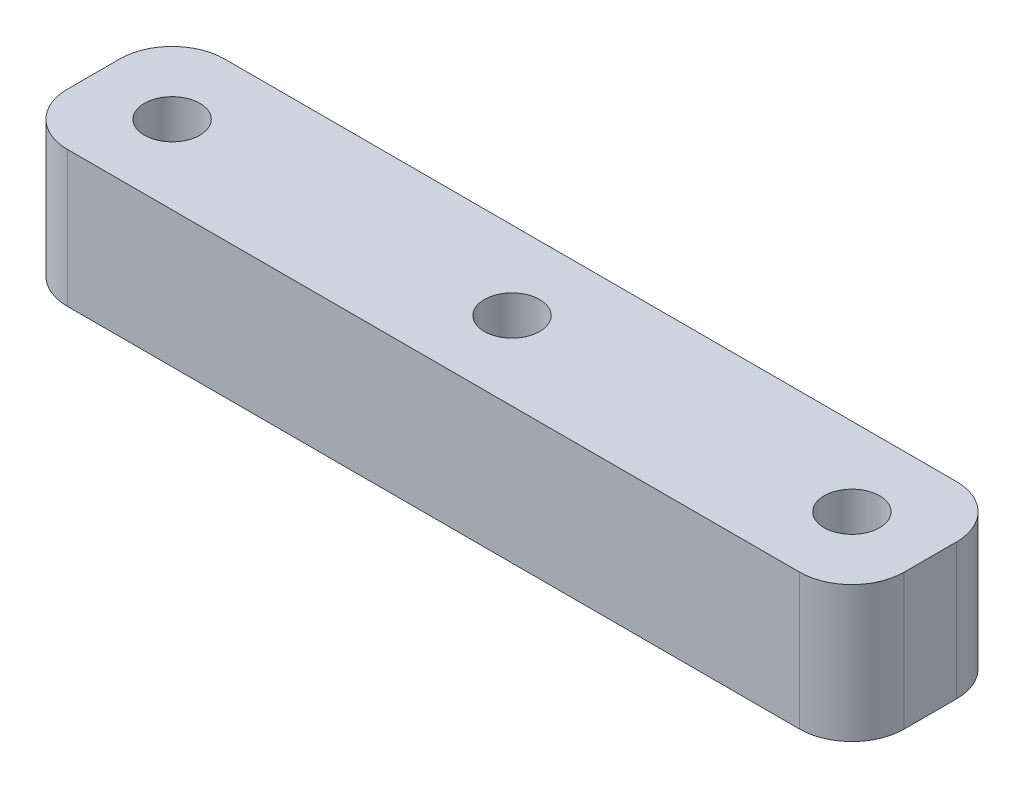
ISO-10303-21;
HEADER;
FILE_DESCRIPTION(('STEP AP214'),'2;1');
FILE_NAME('part.step','',(''),(''),'','','');
FILE_SCHEMA(('AUTOMOTIVE_DESIGN { 1 0 10303 214 1 1 1 1 }'));
ENDSEC;
DATA;
#1=APPLICATION_CONTEXT('core data for automotive mechanical design processes');
#2=APPLICATION_PROTOCOL_DEFINITION('international standard','automotive_design',2000,#1);
#3=PRODUCT_CONTEXT('',#1,'mechanical');
#4=PRODUCT('Part','Part','',(#3));
#5=PRODUCT_RELATED_PRODUCT_CATEGORY('part','',(#4));
#6=PRODUCT_DEFINITION_FORMATION('','',#4);
#7=PRODUCT_DEFINITION_CONTEXT('part definition',#1,'design');
#8=PRODUCT_DEFINITION('design','',#6,#7);
#9=PRODUCT_DEFINITION_SHAPE('','',#8);
#10=(LENGTH_UNIT() NAMED_UNIT(*) SI_UNIT(.MILLI.,.METRE.));
#11=(NAMED_UNIT(*) PLANE_ANGLE_UNIT() SI_UNIT($,.RADIAN.));
#12=(NAMED_UNIT(*) SI_UNIT($,.STERADIAN.) SOLID_ANGLE_UNIT());
#13=UNCERTAINTY_MEASURE_WITH_UNIT(LENGTH_MEASURE(1.E-05),#10,'distance_accuracy_value','');
#14=(GEOMETRIC_REPRESENTATION_CONTEXT(3) GLOBAL_UNCERTAINTY_ASSIGNED_CONTEXT((#13)) GLOBAL_UNIT_ASSIGNED_CONTEXT((#10,
#11,#12)) REPRESENTATION_CONTEXT('',''));
#15=CARTESIAN_POINT('',(0.,0.,0.));
#16=DIRECTION('',(0.,0.,1.));
#17=DIRECTION('',(1.,0.,0.));
#18=AXIS2_PLACEMENT_3D('',#15,#16,#17);
#19=CARTESIAN_POINT('',(-40.,-13.,-7.50000000000001));
#20=DIRECTION('',(-1.,0.,0.));
#21=DIRECTION('',(0.,0.,1.));
#22=AXIS2_PLACEMENT_3D('',#19,#20,#21);
#23=PLANE('',#22);
#24=DIRECTION('',(0.,0.,1.));
#25=VECTOR('',#24,1.);
#26=CARTESIAN_POINT('',(-40.,0.,-7.50000000000001));
#27=LINE('',#26,#25);
#28=CARTESIAN_POINT('',(-40.,0.,-2.50000000000001));
#29=VERTEX_POINT('',#28);
#30=CARTESIAN_POINT('',(-40.,0.,2.49999999999999));
#31=VERTEX_POINT('',#30);
#32=EDGE_CURVE('E185',#29,#31,#27,.T.);
#33=ORIENTED_EDGE('',*,*,#32,.F.);
#34=DIRECTION('',(0.,1.,0.));
#35=VECTOR('',#34,1.);
#36=CARTESIAN_POINT('',(-40.,-13.,-2.50000000000001));
#37=LINE('',#36,#35);
#38=CARTESIAN_POINT('',(-40.,-13.,-2.50000000000001));
#39=VERTEX_POINT('',#38);
#40=EDGE_CURVE('E155',#29,#39,#37,.F.);
#41=ORIENTED_EDGE('',*,*,#40,.T.);
#42=DIRECTION('',(0.,0.,1.));
#43=VECTOR('',#42,1.);
#44=CARTESIAN_POINT('',(-40.,-13.,-7.50000000000001));
#45=LINE('',#44,#43);
#46=CARTESIAN_POINT('',(-40.,-13.,2.49999999999999));
#47=VERTEX_POINT('',#46);
#48=EDGE_CURVE('E129',#39,#47,#45,.T.);
#49=ORIENTED_EDGE('',*,*,#48,.T.);
#50=DIRECTION('',(0.,1.,0.));
#51=VECTOR('',#50,1.);
#52=CARTESIAN_POINT('',(-40.,-13.,2.49999999999999));
#53=LINE('',#52,#51);
#54=EDGE_CURVE('E151',#47,#31,#53,.T.);
#55=ORIENTED_EDGE('',*,*,#54,.T.);
#56=EDGE_LOOP('',(#33,#41,#49,#55));
#57=FACE_BOUND('',#56,.T.);
#58=ADVANCED_FACE('F39',(#57),#23,.T.);
#59=CARTESIAN_POINT('',(-40.,-13.,-7.50000000000001));
#60=DIRECTION('',(0.,0.,-1.));
#61=DIRECTION('',(-1.,0.,0.));
#62=AXIS2_PLACEMENT_3D('',#59,#60,#61);
#63=PLANE('',#62);
#64=DIRECTION('',(-1.,0.,0.));
#65=VECTOR('',#64,1.);
#66=CARTESIAN_POINT('',(-40.,-13.,-7.50000000000001));
#67=LINE('',#66,#65);
#68=CARTESIAN_POINT('',(35.,-13.,-7.50000000000001));
#69=VERTEX_POINT('',#68);
#70=CARTESIAN_POINT('',(-35.,-13.,-7.50000000000001));
#71=VERTEX_POINT('',#70);
#72=EDGE_CURVE('E135',#69,#71,#67,.T.);
#73=ORIENTED_EDGE('',*,*,#72,.T.);
#74=DIRECTION('',(0.,1.,0.));
#75=VECTOR('',#74,1.);
#76=CARTESIAN_POINT('',(-35.,-13.,-7.50000000000001));
#77=LINE('',#76,#75);
#78=CARTESIAN_POINT('',(-35.,0.,-7.50000000000001));
#79=VERTEX_POINT('',#78);
#80=EDGE_CURVE('E127',#71,#79,#77,.T.);
#81=ORIENTED_EDGE('',*,*,#80,.T.);
#82=DIRECTION('',(-1.,0.,0.));
#83=VECTOR('',#82,1.);
#84=CARTESIAN_POINT('',(-40.,0.,-7.50000000000001));
#85=LINE('',#84,#83);
#86=CARTESIAN_POINT('',(35.,0.,-7.50000000000001));
#87=VERTEX_POINT('',#86);
#88=EDGE_CURVE('E109',#87,#79,#85,.T.);
#89=ORIENTED_EDGE('',*,*,#88,.F.);
#90=DIRECTION('',(0.,1.,0.));
#91=VECTOR('',#90,1.);
#92=CARTESIAN_POINT('',(35.,-13.,-7.50000000000001));
#93=LINE('',#92,#91);
#94=EDGE_CURVE('E124',#87,#69,#93,.F.);
#95=ORIENTED_EDGE('',*,*,#94,.T.);
#96=EDGE_LOOP('',(#73,#81,#89,#95));
#97=FACE_BOUND('',#96,.T.);
#98=ADVANCED_FACE('F123',(#97),#63,.T.);
#99=CARTESIAN_POINT('',(40.,-13.,-7.50000000000001));
#100=DIRECTION('',(1.,0.,0.));
#101=DIRECTION('',(0.,0.,-1.));
#102=AXIS2_PLACEMENT_3D('',#99,#100,#101);
#103=PLANE('',#102);
#104=DIRECTION('',(0.,0.,-1.));
#105=VECTOR('',#104,1.);
#106=CARTESIAN_POINT('',(40.,-13.,-7.50000000000001));
#107=LINE('',#106,#105);
#108=CARTESIAN_POINT('',(40.,-13.,2.50000000000001));
#109=VERTEX_POINT('',#108);
#110=CARTESIAN_POINT('',(40.,-13.,-2.50000000000001));
#111=VERTEX_POINT('',#110);
#112=EDGE_CURVE('E141',#109,#111,#107,.T.);
#113=ORIENTED_EDGE('',*,*,#112,.T.);
#114=DIRECTION('',(0.,1.,0.));
#115=VECTOR('',#114,1.);
#116=CARTESIAN_POINT('',(40.,-13.,-2.50000000000001));
#117=LINE('',#116,#115);
#118=CARTESIAN_POINT('',(40.,0.,-2.50000000000001));
#119=VERTEX_POINT('',#118);
#120=EDGE_CURVE('E171',#111,#119,#117,.T.);
#121=ORIENTED_EDGE('',*,*,#120,.T.);
#122=DIRECTION('',(0.,0.,-1.));
#123=VECTOR('',#122,1.);
#124=CARTESIAN_POINT('',(40.,0.,-7.50000000000001));
#125=LINE('',#124,#123);
#126=CARTESIAN_POINT('',(40.,0.,2.50000000000001));
#127=VERTEX_POINT('',#126);
#128=EDGE_CURVE('E111',#127,#119,#125,.T.);
#129=ORIENTED_EDGE('',*,*,#128,.F.);
#130=DIRECTION('',(0.,1.,0.));
#131=VECTOR('',#130,1.);
#132=CARTESIAN_POINT('',(40.,-13.,2.50000000000001));
#133=LINE('',#132,#131);
#134=EDGE_CURVE('E168',#127,#109,#133,.F.);
#135=ORIENTED_EDGE('',*,*,#134,.T.);
#136=EDGE_LOOP('',(#113,#121,#129,#135));
#137=FACE_BOUND('',#136,.T.);
#138=ADVANCED_FACE('F176',(#137),#103,.T.);
#139=CARTESIAN_POINT('',(-40.,-13.,7.49999999999999));
#140=DIRECTION('',(0.,0.,1.));
#141=DIRECTION('',(1.,0.,0.));
#142=AXIS2_PLACEMENT_3D('',#139,#140,#141);
#143=PLANE('',#142);
#144=DIRECTION('',(1.,0.,0.));
#145=VECTOR('',#144,1.);
#146=CARTESIAN_POINT('',(-40.,-13.,7.49999999999999));
#147=LINE('',#146,#145);
#148=CARTESIAN_POINT('',(-35.,-13.,7.49999999999999));
#149=VERTEX_POINT('',#148);
#150=CARTESIAN_POINT('',(35.,-13.,7.50000000000001));
#151=VERTEX_POINT('',#150);
#152=EDGE_CURVE('E179',#149,#151,#147,.T.);
#153=ORIENTED_EDGE('',*,*,#152,.T.);
#154=DIRECTION('',(0.,1.,0.));
#155=VECTOR('',#154,1.);
#156=CARTESIAN_POINT('',(35.,-13.,7.50000000000001));
#157=LINE('',#156,#155);
#158=CARTESIAN_POINT('',(35.,0.,7.50000000000001));
#159=VERTEX_POINT('',#158);
#160=EDGE_CURVE('E11',#151,#159,#157,.T.);
#161=ORIENTED_EDGE('',*,*,#160,.T.);
#162=DIRECTION('',(1.,0.,0.));
#163=VECTOR('',#162,1.);
#164=CARTESIAN_POINT('',(-40.,0.,7.49999999999999));
#165=LINE('',#164,#163);
#166=CARTESIAN_POINT('',(-35.,0.,7.49999999999999));
#167=VERTEX_POINT('',#166);
#168=EDGE_CURVE('E189',#167,#159,#165,.T.);
#169=ORIENTED_EDGE('',*,*,#168,.F.);
#170=DIRECTION('',(0.,1.,0.));
#171=VECTOR('',#170,1.);
#172=CARTESIAN_POINT('',(-35.,-13.,7.49999999999999));
#173=LINE('',#172,#171);
#174=EDGE_CURVE('E48',#167,#149,#173,.F.);
#175=ORIENTED_EDGE('',*,*,#174,.T.);
#176=EDGE_LOOP('',(#153,#161,#169,#175));
#177=FACE_BOUND('',#176,.T.);
#178=ADVANCED_FACE('F229',(#177),#143,.T.);
#179=CARTESIAN_POINT('',(0.,-13.,0.));
#180=DIRECTION('',(0.,1.,0.));
#181=DIRECTION('',(0.,0.,1.));
#182=AXIS2_PLACEMENT_3D('',#179,#180,#181);
#183=PLANE('',#182);
#184=CARTESIAN_POINT('',(-32.5,-13.,0.));
#185=DIRECTION('',(0.,1.,0.));
#186=DIRECTION('',(0.,0.,1.));
#187=AXIS2_PLACEMENT_3D('',#184,#185,#186);
#188=CIRCLE('',#187,2.64999999999999);
#189=CARTESIAN_POINT('',(-32.5,-13.,2.64999999999999));
#190=VERTEX_POINT('',#189);
#191=EDGE_CURVE('E210',#190,#190,#188,.T.);
#192=ORIENTED_EDGE('',*,*,#191,.T.);
#193=EDGE_LOOP('',(#192));
#194=FACE_BOUND('',#193,.T.);
#195=CARTESIAN_POINT('',(0.,-13.,0.));
#196=DIRECTION('',(0.,1.,0.));
#197=DIRECTION('',(0.,0.,1.));
#198=AXIS2_PLACEMENT_3D('',#195,#196,#197);
#199=CIRCLE('',#198,2.64999999999999);
#200=CARTESIAN_POINT('',(0.,-13.,2.64999999999999));
#201=VERTEX_POINT('',#200);
#202=EDGE_CURVE('E202',#201,#201,#199,.T.);
#203=ORIENTED_EDGE('',*,*,#202,.T.);
#204=EDGE_LOOP('',(#203));
#205=FACE_BOUND('',#204,.T.);
#206=CARTESIAN_POINT('',(32.5,-13.,0.));
#207=DIRECTION('',(0.,1.,0.));
#208=DIRECTION('',(0.,0.,1.));
#209=AXIS2_PLACEMENT_3D('',#206,#207,#208);
#210=CIRCLE('',#209,2.64999999999999);
#211=CARTESIAN_POINT('',(32.5,-13.,2.64999999999999));
#212=VERTEX_POINT('',#211);
#213=EDGE_CURVE('E190',#212,#212,#210,.T.);
#214=ORIENTED_EDGE('',*,*,#213,.T.);
#215=EDGE_LOOP('',(#214));
#216=FACE_BOUND('',#215,.T.);
#217=ORIENTED_EDGE('',*,*,#48,.F.);
#218=CARTESIAN_POINT('',(-35.,-13.,-2.50000000000001));
#219=DIRECTION('',(0.,1.,0.));
#220=DIRECTION('',(0.,0.,1.));
#221=AXIS2_PLACEMENT_3D('',#218,#219,#220);
#222=CIRCLE('',#221,5.);
#223=EDGE_CURVE('E165',#39,#71,#222,.F.);
#224=ORIENTED_EDGE('',*,*,#223,.T.);
#225=ORIENTED_EDGE('',*,*,#72,.F.);
#226=CARTESIAN_POINT('',(35.,-13.,-2.50000000000001));
#227=DIRECTION('',(0.,1.,0.));
#228=DIRECTION('',(0.,0.,1.));
#229=AXIS2_PLACEMENT_3D('',#226,#227,#228);
#230=CIRCLE('',#229,5.);
#231=EDGE_CURVE('E133',#69,#111,#230,.F.);
#232=ORIENTED_EDGE('',*,*,#231,.T.);
#233=ORIENTED_EDGE('',*,*,#112,.F.);
#234=CARTESIAN_POINT('',(35.,-13.,2.50000000000001));
#235=DIRECTION('',(0.,1.,0.));
#236=DIRECTION('',(0.,0.,1.));
#237=AXIS2_PLACEMENT_3D('',#234,#235,#236);
#238=CIRCLE('',#237,5.);
#239=EDGE_CURVE('E55',#109,#151,#238,.F.);
#240=ORIENTED_EDGE('',*,*,#239,.T.);
#241=ORIENTED_EDGE('',*,*,#152,.F.);
#242=CARTESIAN_POINT('',(-35.,-13.,2.49999999999999));
#243=DIRECTION('',(0.,1.,0.));
#244=DIRECTION('',(0.,0.,1.));
#245=AXIS2_PLACEMENT_3D('',#242,#243,#244);
#246=CIRCLE('',#245,5.);
#247=EDGE_CURVE('E158',#149,#47,#246,.F.);
#248=ORIENTED_EDGE('',*,*,#247,.T.);
#249=EDGE_LOOP('',(#217,#224,#225,#232,#233,#240,#241,#248));
#250=FACE_BOUND('',#249,.T.);
#251=ADVANCED_FACE('F258',(#194,#205,#216,#250),#183,.F.);
#252=CARTESIAN_POINT('',(0.,0.,0.));
#253=DIRECTION('',(0.,1.,0.));
#254=DIRECTION('',(0.,0.,1.));
#255=AXIS2_PLACEMENT_3D('',#252,#253,#254);
#256=PLANE('',#255);
#257=CARTESIAN_POINT('',(-32.5,0.,0.));
#258=DIRECTION('',(0.,1.,0.));
#259=DIRECTION('',(0.,0.,1.));
#260=AXIS2_PLACEMENT_3D('',#257,#258,#259);
#261=CIRCLE('',#260,2.64999999999999);
#262=CARTESIAN_POINT('',(-32.5,0.,2.64999999999999));
#263=VERTEX_POINT('',#262);
#264=EDGE_CURVE('E214',#263,#263,#261,.T.);
#265=ORIENTED_EDGE('',*,*,#264,.F.);
#266=EDGE_LOOP('',(#265));
#267=FACE_BOUND('',#266,.T.);
#268=CARTESIAN_POINT('',(0.,0.,0.));
#269=DIRECTION('',(0.,1.,0.));
#270=DIRECTION('',(0.,0.,1.));
#271=AXIS2_PLACEMENT_3D('',#268,#269,#270);
#272=CIRCLE('',#271,2.64999999999999);
#273=CARTESIAN_POINT('',(0.,0.,2.64999999999999));
#274=VERTEX_POINT('',#273);
#275=EDGE_CURVE('E206',#274,#274,#272,.T.);
#276=ORIENTED_EDGE('',*,*,#275,.F.);
#277=EDGE_LOOP('',(#276));
#278=FACE_BOUND('',#277,.T.);
#279=CARTESIAN_POINT('',(32.5,0.,0.));
#280=DIRECTION('',(0.,1.,0.));
#281=DIRECTION('',(0.,0.,1.));
#282=AXIS2_PLACEMENT_3D('',#279,#280,#281);
#283=CIRCLE('',#282,2.64999999999999);
#284=CARTESIAN_POINT('',(32.5,0.,2.64999999999999));
#285=VERTEX_POINT('',#284);
#286=EDGE_CURVE('E198',#285,#285,#283,.T.);
#287=ORIENTED_EDGE('',*,*,#286,.F.);
#288=EDGE_LOOP('',(#287));
#289=FACE_BOUND('',#288,.T.);
#290=ORIENTED_EDGE('',*,*,#88,.T.);
#291=CARTESIAN_POINT('',(-35.,0.,-2.50000000000001));
#292=DIRECTION('',(0.,1.,0.));
#293=DIRECTION('',(0.,0.,1.));
#294=AXIS2_PLACEMENT_3D('',#291,#292,#293);
#295=CIRCLE('',#294,5.);
#296=EDGE_CURVE('E117',#79,#29,#295,.T.);
#297=ORIENTED_EDGE('',*,*,#296,.T.);
#298=ORIENTED_EDGE('',*,*,#32,.T.);
#299=CARTESIAN_POINT('',(-35.,0.,2.49999999999999));
#300=DIRECTION('',(0.,1.,0.));
#301=DIRECTION('',(0.,0.,1.));
#302=AXIS2_PLACEMENT_3D('',#299,#300,#301);
#303=CIRCLE('',#302,5.);
#304=EDGE_CURVE('E139',#31,#167,#303,.T.);
#305=ORIENTED_EDGE('',*,*,#304,.T.);
#306=ORIENTED_EDGE('',*,*,#168,.T.);
#307=CARTESIAN_POINT('',(35.,0.,2.50000000000001));
#308=DIRECTION('',(0.,1.,0.));
#309=DIRECTION('',(0.,0.,1.));
#310=AXIS2_PLACEMENT_3D('',#307,#308,#309);
#311=CIRCLE('',#310,5.);
#312=EDGE_CURVE('E118',#159,#127,#311,.T.);
#313=ORIENTED_EDGE('',*,*,#312,.T.);
#314=ORIENTED_EDGE('',*,*,#128,.T.);
#315=CARTESIAN_POINT('',(35.,0.,-2.50000000000001));
#316=DIRECTION('',(0.,1.,0.));
#317=DIRECTION('',(0.,0.,1.));
#318=AXIS2_PLACEMENT_3D('',#315,#316,#317);
#319=CIRCLE('',#318,5.);
#320=EDGE_CURVE('E106',#119,#87,#319,.T.);
#321=ORIENTED_EDGE('',*,*,#320,.T.);
#322=EDGE_LOOP('',(#290,#297,#298,#305,#306,#313,#314,#321));
#323=FACE_BOUND('',#322,.T.);
#324=ADVANCED_FACE('F108',(#267,#278,#289,#323),#256,.T.);
#325=CARTESIAN_POINT('',(32.5,0.,0.));
#326=DIRECTION('',(0.,1.,0.));
#327=DIRECTION('',(0.,0.,1.));
#328=AXIS2_PLACEMENT_3D('',#325,#326,#327);
#329=CYLINDRICAL_SURFACE('',#328,2.64999999999999);
#330=ORIENTED_EDGE('',*,*,#213,.F.);
#331=EDGE_LOOP('',(#330));
#332=FACE_BOUND('',#331,.T.);
#333=ORIENTED_EDGE('',*,*,#286,.T.);
#334=EDGE_LOOP('',(#333));
#335=FACE_BOUND('',#334,.T.);
#336=ADVANCED_FACE('F266',(#332,#335),#329,.F.);
#337=CARTESIAN_POINT('',(0.,0.,0.));
#338=DIRECTION('',(0.,1.,0.));
#339=DIRECTION('',(0.,0.,1.));
#340=AXIS2_PLACEMENT_3D('',#337,#338,#339);
#341=CYLINDRICAL_SURFACE('',#340,2.64999999999999);
#342=ORIENTED_EDGE('',*,*,#202,.F.);
#343=EDGE_LOOP('',(#342));
#344=FACE_BOUND('',#343,.T.);
#345=ORIENTED_EDGE('',*,*,#275,.T.);
#346=EDGE_LOOP('',(#345));
#347=FACE_BOUND('',#346,.T.);
#348=ADVANCED_FACE('F255',(#344,#347),#341,.F.);
#349=CARTESIAN_POINT('',(-32.5,0.,0.));
#350=DIRECTION('',(0.,1.,0.));
#351=DIRECTION('',(0.,0.,1.));
#352=AXIS2_PLACEMENT_3D('',#349,#350,#351);
#353=CYLINDRICAL_SURFACE('',#352,2.64999999999999);
#354=ORIENTED_EDGE('',*,*,#191,.F.);
#355=EDGE_LOOP('',(#354));
#356=FACE_BOUND('',#355,.T.);
#357=ORIENTED_EDGE('',*,*,#264,.T.);
#358=EDGE_LOOP('',(#357));
#359=FACE_BOUND('',#358,.T.);
#360=ADVANCED_FACE('F250',(#356,#359),#353,.F.);
#361=CARTESIAN_POINT('',(-35.,-13.,-2.50000000000001));
#362=DIRECTION('',(0.,1.,0.));
#363=DIRECTION('',(0.,0.,1.));
#364=AXIS2_PLACEMENT_3D('',#361,#362,#363);
#365=CYLINDRICAL_SURFACE('',#364,5.);
#366=ORIENTED_EDGE('',*,*,#223,.F.);
#367=ORIENTED_EDGE('',*,*,#40,.F.);
#368=ORIENTED_EDGE('',*,*,#296,.F.);
#369=ORIENTED_EDGE('',*,*,#80,.F.);
#370=EDGE_LOOP('',(#366,#367,#368,#369));
#371=FACE_BOUND('',#370,.T.);
#372=ADVANCED_FACE('F238',(#371),#365,.T.);
#373=CARTESIAN_POINT('',(35.,-13.,-2.50000000000001));
#374=DIRECTION('',(0.,1.,0.));
#375=DIRECTION('',(0.,0.,1.));
#376=AXIS2_PLACEMENT_3D('',#373,#374,#375);
#377=CYLINDRICAL_SURFACE('',#376,5.);
#378=ORIENTED_EDGE('',*,*,#231,.F.);
#379=ORIENTED_EDGE('',*,*,#94,.F.);
#380=ORIENTED_EDGE('',*,*,#320,.F.);
#381=ORIENTED_EDGE('',*,*,#120,.F.);
#382=EDGE_LOOP('',(#378,#379,#380,#381));
#383=FACE_BOUND('',#382,.T.);
#384=ADVANCED_FACE('F132',(#383),#377,.T.);
#385=CARTESIAN_POINT('',(35.,-13.,2.50000000000001));
#386=DIRECTION('',(0.,1.,0.));
#387=DIRECTION('',(0.,0.,1.));
#388=AXIS2_PLACEMENT_3D('',#385,#386,#387);
#389=CYLINDRICAL_SURFACE('',#388,5.);
#390=ORIENTED_EDGE('',*,*,#239,.F.);
#391=ORIENTED_EDGE('',*,*,#134,.F.);
#392=ORIENTED_EDGE('',*,*,#312,.F.);
#393=ORIENTED_EDGE('',*,*,#160,.F.);
#394=EDGE_LOOP('',(#390,#391,#392,#393));
#395=FACE_BOUND('',#394,.T.);
#396=ADVANCED_FACE('F232',(#395),#389,.T.);
#397=CARTESIAN_POINT('',(-35.,-13.,2.49999999999999));
#398=DIRECTION('',(0.,1.,0.));
#399=DIRECTION('',(0.,0.,1.));
#400=AXIS2_PLACEMENT_3D('',#397,#398,#399);
#401=CYLINDRICAL_SURFACE('',#400,5.);
#402=ORIENTED_EDGE('',*,*,#247,.F.);
#403=ORIENTED_EDGE('',*,*,#174,.F.);
#404=ORIENTED_EDGE('',*,*,#304,.F.);
#405=ORIENTED_EDGE('',*,*,#54,.F.);
#406=EDGE_LOOP('',(#402,#403,#404,#405));
#407=FACE_BOUND('',#406,.T.);
#408=ADVANCED_FACE('F41',(#407),#401,.T.);
#409=CLOSED_SHELL('',(#58,#98,#138,#178,#251,#324,#336,#348,#360,#372,#384,#396,#408));
#410=MANIFOLD_SOLID_BREP('B2',#409);
#411=ADVANCED_BREP_SHAPE_REPRESENTATION('',(#18,#410),#14);
#412=SHAPE_DEFINITION_REPRESENTATION(#9,#411);
ENDSEC;
END-ISO-10303-21;
